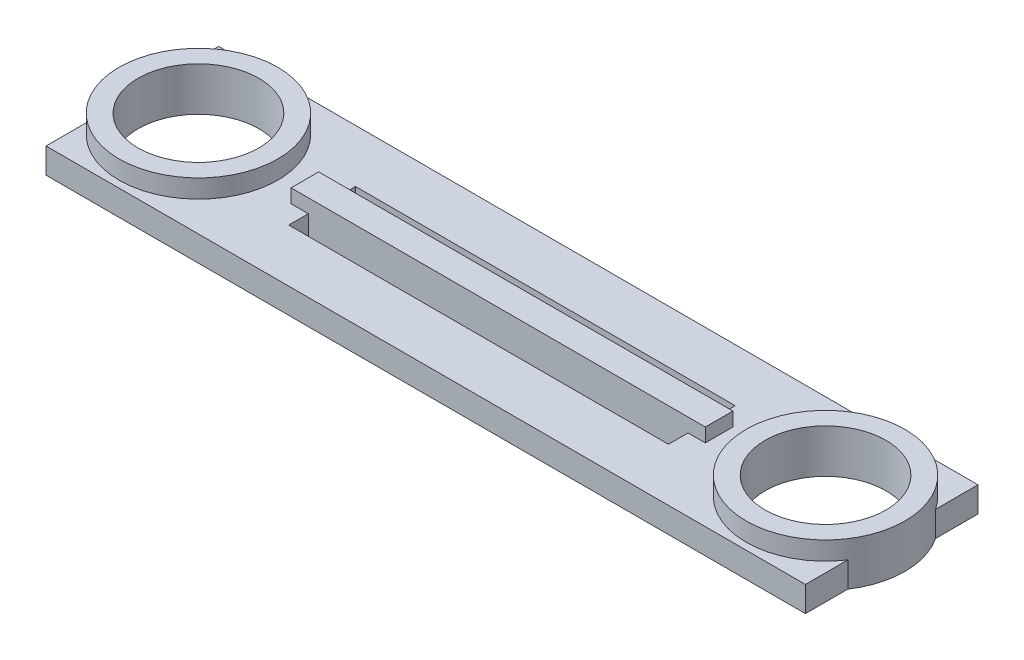
ISO-10303-21;
HEADER;
FILE_DESCRIPTION(('STEP AP214'),'2;1');
FILE_NAME('part.step','',(''),(''),'','','');
FILE_SCHEMA(('AUTOMOTIVE_DESIGN { 1 0 10303 214 1 1 1 1 }'));
ENDSEC;
DATA;
#1=APPLICATION_CONTEXT('core data for automotive mechanical design processes');
#2=APPLICATION_PROTOCOL_DEFINITION('international standard','automotive_design',2000,#1);
#3=PRODUCT_CONTEXT('',#1,'mechanical');
#4=PRODUCT('Part','Part','',(#3));
#5=PRODUCT_RELATED_PRODUCT_CATEGORY('part','',(#4));
#6=PRODUCT_DEFINITION_FORMATION('','',#4);
#7=PRODUCT_DEFINITION_CONTEXT('part definition',#1,'design');
#8=PRODUCT_DEFINITION('design','',#6,#7);
#9=PRODUCT_DEFINITION_SHAPE('','',#8);
#10=(LENGTH_UNIT() NAMED_UNIT(*) SI_UNIT(.MILLI.,.METRE.));
#11=(NAMED_UNIT(*) PLANE_ANGLE_UNIT() SI_UNIT($,.RADIAN.));
#12=(NAMED_UNIT(*) SI_UNIT($,.STERADIAN.) SOLID_ANGLE_UNIT());
#13=UNCERTAINTY_MEASURE_WITH_UNIT(LENGTH_MEASURE(1.E-05),#10,'distance_accuracy_value','');
#14=(GEOMETRIC_REPRESENTATION_CONTEXT(3) GLOBAL_UNCERTAINTY_ASSIGNED_CONTEXT((#13)) GLOBAL_UNIT_ASSIGNED_CONTEXT((#10,
#11,#12)) REPRESENTATION_CONTEXT('',''));
#15=CARTESIAN_POINT('',(0.,0.,0.));
#16=DIRECTION('',(0.,0.,1.));
#17=DIRECTION('',(1.,0.,0.));
#18=AXIS2_PLACEMENT_3D('',#15,#16,#17);
#19=CARTESIAN_POINT('',(0.,22.,0.));
#20=DIRECTION('',(0.,-1.,0.));
#21=DIRECTION('',(0.,0.,-1.));
#22=AXIS2_PLACEMENT_3D('',#19,#20,#21);
#23=PLANE('',#22);
#24=CARTESIAN_POINT('',(272.5,22.,0.));
#25=DIRECTION('',(0.,-1.,0.));
#26=DIRECTION('',(0.,0.,-1.));
#27=AXIS2_PLACEMENT_3D('',#24,#25,#26);
#28=CIRCLE('',#27,69.);
#29=CARTESIAN_POINT('',(330.,22.,-38.1411850890871));
#30=VERTEX_POINT('',#29);
#31=CARTESIAN_POINT('',(330.,22.,38.1411850890871));
#32=VERTEX_POINT('',#31);
#33=EDGE_CURVE('E229',#30,#32,#28,.F.);
#34=ORIENTED_EDGE('',*,*,#33,.F.);
#35=DIRECTION('',(0.,0.,-1.));
#36=VECTOR('',#35,1.);
#37=CARTESIAN_POINT('',(330.,22.,75.));
#38=LINE('',#37,#36);
#39=CARTESIAN_POINT('',(330.,22.,-75.));
#40=VERTEX_POINT('',#39);
#41=EDGE_CURVE('E290',#30,#40,#38,.T.);
#42=ORIENTED_EDGE('',*,*,#41,.T.);
#43=DIRECTION('',(-1.,0.,0.));
#44=VECTOR('',#43,1.);
#45=CARTESIAN_POINT('',(-330.,22.,-75.));
#46=LINE('',#45,#44);
#47=CARTESIAN_POINT('',(-330.,22.,-75.));
#48=VERTEX_POINT('',#47);
#49=EDGE_CURVE('E289',#40,#48,#46,.T.);
#50=ORIENTED_EDGE('',*,*,#49,.T.);
#51=DIRECTION('',(0.,0.,1.));
#52=VECTOR('',#51,1.);
#53=CARTESIAN_POINT('',(-330.,22.,75.));
#54=LINE('',#53,#52);
#55=CARTESIAN_POINT('',(-330.,22.,-38.1411850890871));
#56=VERTEX_POINT('',#55);
#57=EDGE_CURVE('E293',#48,#56,#54,.T.);
#58=ORIENTED_EDGE('',*,*,#57,.T.);
#59=CARTESIAN_POINT('',(-272.5,22.,0.));
#60=DIRECTION('',(0.,-1.,0.));
#61=DIRECTION('',(0.,0.,-1.));
#62=AXIS2_PLACEMENT_3D('',#59,#60,#61);
#63=CIRCLE('',#62,69.);
#64=CARTESIAN_POINT('',(-330.,22.,38.1411850890871));
#65=VERTEX_POINT('',#64);
#66=EDGE_CURVE('E239',#65,#56,#63,.F.);
#67=ORIENTED_EDGE('',*,*,#66,.F.);
#68=CARTESIAN_POINT('',(-330.,22.,75.));
#69=VERTEX_POINT('',#68);
#70=EDGE_CURVE('E292',#65,#69,#54,.T.);
#71=ORIENTED_EDGE('',*,*,#70,.T.);
#72=DIRECTION('',(1.,0.,0.));
#73=VECTOR('',#72,1.);
#74=CARTESIAN_POINT('',(-330.,22.,75.));
#75=LINE('',#74,#73);
#76=CARTESIAN_POINT('',(330.,22.,75.));
#77=VERTEX_POINT('',#76);
#78=EDGE_CURVE('E296',#69,#77,#75,.T.);
#79=ORIENTED_EDGE('',*,*,#78,.T.);
#80=EDGE_CURVE('E286',#77,#32,#38,.T.);
#81=ORIENTED_EDGE('',*,*,#80,.T.);
#82=EDGE_LOOP('',(#34,#42,#50,#58,#67,#71,#79,#81));
#83=FACE_BOUND('',#82,.T.);
#84=DIRECTION('',(-1.,0.,0.));
#85=VECTOR('',#84,1.);
#86=CARTESIAN_POINT('',(0.,22.,-12.));
#87=LINE('',#86,#85);
#88=CARTESIAN_POINT('',(-165.,22.,-12.));
#89=VERTEX_POINT('',#88);
#90=CARTESIAN_POINT('',(-180.,22.,-12.));
#91=VERTEX_POINT('',#90);
#92=EDGE_CURVE('E211',#89,#91,#87,.T.);
#93=ORIENTED_EDGE('',*,*,#92,.F.);
#94=DIRECTION('',(0.,0.,1.));
#95=VECTOR('',#94,1.);
#96=CARTESIAN_POINT('',(-165.,22.,29.));
#97=LINE('',#96,#95);
#98=CARTESIAN_POINT('',(-165.,22.,-29.));
#99=VERTEX_POINT('',#98);
#100=EDGE_CURVE('E252',#99,#89,#97,.T.);
#101=ORIENTED_EDGE('',*,*,#100,.F.);
#102=DIRECTION('',(-1.,0.,0.));
#103=VECTOR('',#102,1.);
#104=CARTESIAN_POINT('',(-165.,22.,-29.));
#105=LINE('',#104,#103);
#106=CARTESIAN_POINT('',(165.,22.,-29.));
#107=VERTEX_POINT('',#106);
#108=EDGE_CURVE('E248',#107,#99,#105,.T.);
#109=ORIENTED_EDGE('',*,*,#108,.F.);
#110=DIRECTION('',(0.,0.,-1.));
#111=VECTOR('',#110,1.);
#112=CARTESIAN_POINT('',(165.,22.,29.));
#113=LINE('',#112,#111);
#114=CARTESIAN_POINT('',(165.,22.,-12.));
#115=VERTEX_POINT('',#114);
#116=EDGE_CURVE('E249',#115,#107,#113,.T.);
#117=ORIENTED_EDGE('',*,*,#116,.F.);
#118=CARTESIAN_POINT('',(180.,22.,-12.));
#119=VERTEX_POINT('',#118);
#120=EDGE_CURVE('E214',#119,#115,#87,.T.);
#121=ORIENTED_EDGE('',*,*,#120,.F.);
#122=DIRECTION('',(0.,0.,-1.));
#123=VECTOR('',#122,1.);
#124=CARTESIAN_POINT('',(180.,22.,0.));
#125=LINE('',#124,#123);
#126=CARTESIAN_POINT('',(180.,22.,12.));
#127=VERTEX_POINT('',#126);
#128=EDGE_CURVE('E199',#127,#119,#125,.T.);
#129=ORIENTED_EDGE('',*,*,#128,.F.);
#130=DIRECTION('',(1.,0.,0.));
#131=VECTOR('',#130,1.);
#132=CARTESIAN_POINT('',(0.,22.,12.));
#133=LINE('',#132,#131);
#134=CARTESIAN_POINT('',(165.,22.,12.));
#135=VERTEX_POINT('',#134);
#136=EDGE_CURVE('E204',#135,#127,#133,.T.);
#137=ORIENTED_EDGE('',*,*,#136,.F.);
#138=CARTESIAN_POINT('',(165.,22.,29.));
#139=VERTEX_POINT('',#138);
#140=EDGE_CURVE('E245',#139,#135,#113,.T.);
#141=ORIENTED_EDGE('',*,*,#140,.F.);
#142=DIRECTION('',(1.,0.,0.));
#143=VECTOR('',#142,1.);
#144=CARTESIAN_POINT('',(-165.,22.,29.));
#145=LINE('',#144,#143);
#146=CARTESIAN_POINT('',(-165.,22.,29.));
#147=VERTEX_POINT('',#146);
#148=EDGE_CURVE('E255',#147,#139,#145,.T.);
#149=ORIENTED_EDGE('',*,*,#148,.F.);
#150=CARTESIAN_POINT('',(-165.,22.,12.));
#151=VERTEX_POINT('',#150);
#152=EDGE_CURVE('E251',#151,#147,#97,.T.);
#153=ORIENTED_EDGE('',*,*,#152,.F.);
#154=CARTESIAN_POINT('',(-180.,22.,12.));
#155=VERTEX_POINT('',#154);
#156=EDGE_CURVE('E200',#155,#151,#133,.T.);
#157=ORIENTED_EDGE('',*,*,#156,.F.);
#158=DIRECTION('',(0.,0.,1.));
#159=VECTOR('',#158,1.);
#160=CARTESIAN_POINT('',(-180.,22.,0.));
#161=LINE('',#160,#159);
#162=EDGE_CURVE('E217',#91,#155,#161,.T.);
#163=ORIENTED_EDGE('',*,*,#162,.F.);
#164=EDGE_LOOP('',(#93,#101,#109,#117,#121,#129,#137,#141,#149,#153,#157,#163));
#165=FACE_BOUND('',#164,.T.);
#166=ADVANCED_FACE('F39',(#83,#165),#23,.F.);
#167=CARTESIAN_POINT('',(165.,22.,29.));
#168=DIRECTION('',(-1.,0.,0.));
#169=DIRECTION('',(0.,0.,1.));
#170=AXIS2_PLACEMENT_3D('',#167,#168,#169);
#171=PLANE('',#170);
#172=DIRECTION('',(0.,0.,-1.));
#173=VECTOR('',#172,1.);
#174=CARTESIAN_POINT('',(165.,0.,29.));
#175=LINE('',#174,#173);
#176=CARTESIAN_POINT('',(165.,0.,-12.));
#177=VERTEX_POINT('',#176);
#178=CARTESIAN_POINT('',(165.,0.,-29.));
#179=VERTEX_POINT('',#178);
#180=EDGE_CURVE('E244',#177,#179,#175,.T.);
#181=ORIENTED_EDGE('',*,*,#180,.F.);
#182=DIRECTION('',(0.,1.,0.));
#183=VECTOR('',#182,1.);
#184=CARTESIAN_POINT('',(165.,22.,-12.));
#185=LINE('',#184,#183);
#186=EDGE_CURVE('E213',#177,#115,#185,.T.);
#187=ORIENTED_EDGE('',*,*,#186,.T.);
#188=ORIENTED_EDGE('',*,*,#116,.T.);
#189=DIRECTION('',(0.,-1.,0.));
#190=VECTOR('',#189,1.);
#191=CARTESIAN_POINT('',(165.,22.,-29.));
#192=LINE('',#191,#190);
#193=EDGE_CURVE('E276',#107,#179,#192,.T.);
#194=ORIENTED_EDGE('',*,*,#193,.T.);
#195=EDGE_LOOP('',(#181,#187,#188,#194));
#196=FACE_BOUND('',#195,.T.);
#197=ADVANCED_FACE('F389',(#196),#171,.T.);
#198=ORIENTED_EDGE('',*,*,#140,.T.);
#199=DIRECTION('',(0.,-1.,0.));
#200=VECTOR('',#199,1.);
#201=CARTESIAN_POINT('',(165.,22.,12.));
#202=LINE('',#201,#200);
#203=CARTESIAN_POINT('',(165.,0.,12.));
#204=VERTEX_POINT('',#203);
#205=EDGE_CURVE('E202',#135,#204,#202,.T.);
#206=ORIENTED_EDGE('',*,*,#205,.T.);
#207=CARTESIAN_POINT('',(165.,0.,29.));
#208=VERTEX_POINT('',#207);
#209=EDGE_CURVE('E258',#208,#204,#175,.T.);
#210=ORIENTED_EDGE('',*,*,#209,.F.);
#211=DIRECTION('',(0.,-1.,0.));
#212=VECTOR('',#211,1.);
#213=CARTESIAN_POINT('',(165.,22.,29.));
#214=LINE('',#213,#212);
#215=EDGE_CURVE('E257',#139,#208,#214,.T.);
#216=ORIENTED_EDGE('',*,*,#215,.F.);
#217=EDGE_LOOP('',(#198,#206,#210,#216));
#218=FACE_BOUND('',#217,.T.);
#219=ADVANCED_FACE('F349',(#218),#171,.T.);
#220=CARTESIAN_POINT('',(-165.,22.,29.));
#221=DIRECTION('',(1.,0.,0.));
#222=DIRECTION('',(0.,0.,-1.));
#223=AXIS2_PLACEMENT_3D('',#220,#221,#222);
#224=PLANE('',#223);
#225=ORIENTED_EDGE('',*,*,#100,.T.);
#226=DIRECTION('',(0.,-1.,0.));
#227=VECTOR('',#226,1.);
#228=CARTESIAN_POINT('',(-165.,22.,-12.));
#229=LINE('',#228,#227);
#230=CARTESIAN_POINT('',(-165.,0.,-12.));
#231=VERTEX_POINT('',#230);
#232=EDGE_CURVE('E11',#89,#231,#229,.T.);
#233=ORIENTED_EDGE('',*,*,#232,.T.);
#234=DIRECTION('',(0.,0.,1.));
#235=VECTOR('',#234,1.);
#236=CARTESIAN_POINT('',(-165.,0.,29.));
#237=LINE('',#236,#235);
#238=CARTESIAN_POINT('',(-165.,0.,-29.));
#239=VERTEX_POINT('',#238);
#240=EDGE_CURVE('E264',#239,#231,#237,.T.);
#241=ORIENTED_EDGE('',*,*,#240,.F.);
#242=DIRECTION('',(0.,-1.,0.));
#243=VECTOR('',#242,1.);
#244=CARTESIAN_POINT('',(-165.,22.,-29.));
#245=LINE('',#244,#243);
#246=EDGE_CURVE('E274',#99,#239,#245,.T.);
#247=ORIENTED_EDGE('',*,*,#246,.F.);
#248=EDGE_LOOP('',(#225,#233,#241,#247));
#249=FACE_BOUND('',#248,.T.);
#250=ADVANCED_FACE('F437',(#249),#224,.T.);
#251=CARTESIAN_POINT('',(-165.,0.,12.));
#252=VERTEX_POINT('',#251);
#253=CARTESIAN_POINT('',(-165.,0.,29.));
#254=VERTEX_POINT('',#253);
#255=EDGE_CURVE('E263',#252,#254,#237,.T.);
#256=ORIENTED_EDGE('',*,*,#255,.F.);
#257=DIRECTION('',(0.,1.,0.));
#258=VECTOR('',#257,1.);
#259=CARTESIAN_POINT('',(-165.,22.,12.));
#260=LINE('',#259,#258);
#261=EDGE_CURVE('E47',#252,#151,#260,.T.);
#262=ORIENTED_EDGE('',*,*,#261,.T.);
#263=ORIENTED_EDGE('',*,*,#152,.T.);
#264=DIRECTION('',(0.,-1.,0.));
#265=VECTOR('',#264,1.);
#266=CARTESIAN_POINT('',(-165.,22.,29.));
#267=LINE('',#266,#265);
#268=EDGE_CURVE('E271',#147,#254,#267,.T.);
#269=ORIENTED_EDGE('',*,*,#268,.T.);
#270=EDGE_LOOP('',(#256,#262,#263,#269));
#271=FACE_BOUND('',#270,.T.);
#272=ADVANCED_FACE('F334',(#271),#224,.T.);
#273=CARTESIAN_POINT('',(330.,22.,75.));
#274=DIRECTION('',(-1.,0.,0.));
#275=DIRECTION('',(0.,0.,1.));
#276=AXIS2_PLACEMENT_3D('',#273,#274,#275);
#277=PLANE('',#276);
#278=DIRECTION('',(0.,-1.,0.));
#279=VECTOR('',#278,1.);
#280=CARTESIAN_POINT('',(330.,38.,-38.1411850890871));
#281=LINE('',#280,#279);
#282=CARTESIAN_POINT('',(330.,0.,-38.1411850890871));
#283=VERTEX_POINT('',#282);
#284=EDGE_CURVE('E328',#283,#30,#281,.F.);
#285=ORIENTED_EDGE('',*,*,#284,.F.);
#286=DIRECTION('',(0.,0.,-1.));
#287=VECTOR('',#286,1.);
#288=CARTESIAN_POINT('',(330.,0.,75.));
#289=LINE('',#288,#287);
#290=CARTESIAN_POINT('',(330.,0.,-75.));
#291=VERTEX_POINT('',#290);
#292=EDGE_CURVE('E285',#283,#291,#289,.T.);
#293=ORIENTED_EDGE('',*,*,#292,.T.);
#294=DIRECTION('',(0.,-1.,0.));
#295=VECTOR('',#294,1.);
#296=CARTESIAN_POINT('',(330.,22.,-75.));
#297=LINE('',#296,#295);
#298=EDGE_CURVE('E316',#40,#291,#297,.T.);
#299=ORIENTED_EDGE('',*,*,#298,.F.);
#300=ORIENTED_EDGE('',*,*,#41,.F.);
#301=EDGE_LOOP('',(#285,#293,#299,#300));
#302=FACE_BOUND('',#301,.T.);
#303=ADVANCED_FACE('F41',(#302),#277,.F.);
#304=DIRECTION('',(0.,-1.,0.));
#305=VECTOR('',#304,1.);
#306=CARTESIAN_POINT('',(330.,38.,38.1411850890871));
#307=LINE('',#306,#305);
#308=CARTESIAN_POINT('',(330.,0.,38.1411850890871));
#309=VERTEX_POINT('',#308);
#310=EDGE_CURVE('E325',#32,#309,#307,.T.);
#311=ORIENTED_EDGE('',*,*,#310,.F.);
#312=ORIENTED_EDGE('',*,*,#80,.F.);
#313=DIRECTION('',(0.,-1.,0.));
#314=VECTOR('',#313,1.);
#315=CARTESIAN_POINT('',(330.,22.,75.));
#316=LINE('',#315,#314);
#317=CARTESIAN_POINT('',(330.,0.,75.));
#318=VERTEX_POINT('',#317);
#319=EDGE_CURVE('E298',#77,#318,#316,.T.);
#320=ORIENTED_EDGE('',*,*,#319,.T.);
#321=EDGE_CURVE('E299',#318,#309,#289,.T.);
#322=ORIENTED_EDGE('',*,*,#321,.T.);
#323=EDGE_LOOP('',(#311,#312,#320,#322));
#324=FACE_BOUND('',#323,.T.);
#325=ADVANCED_FACE('F404',(#324),#277,.F.);
#326=CARTESIAN_POINT('',(-330.,22.,75.));
#327=DIRECTION('',(1.,0.,0.));
#328=DIRECTION('',(0.,0.,-1.));
#329=AXIS2_PLACEMENT_3D('',#326,#327,#328);
#330=PLANE('',#329);
#331=DIRECTION('',(0.,-1.,0.));
#332=VECTOR('',#331,1.);
#333=CARTESIAN_POINT('',(-330.,38.,38.1411850890871));
#334=LINE('',#333,#332);
#335=CARTESIAN_POINT('',(-330.,0.,38.1411850890871));
#336=VERTEX_POINT('',#335);
#337=EDGE_CURVE('E322',#336,#65,#334,.F.);
#338=ORIENTED_EDGE('',*,*,#337,.F.);
#339=DIRECTION('',(0.,0.,1.));
#340=VECTOR('',#339,1.);
#341=CARTESIAN_POINT('',(-330.,0.,75.));
#342=LINE('',#341,#340);
#343=CARTESIAN_POINT('',(-330.,0.,75.));
#344=VERTEX_POINT('',#343);
#345=EDGE_CURVE('E303',#336,#344,#342,.T.);
#346=ORIENTED_EDGE('',*,*,#345,.T.);
#347=DIRECTION('',(0.,-1.,0.));
#348=VECTOR('',#347,1.);
#349=CARTESIAN_POINT('',(-330.,22.,75.));
#350=LINE('',#349,#348);
#351=EDGE_CURVE('E310',#69,#344,#350,.T.);
#352=ORIENTED_EDGE('',*,*,#351,.F.);
#353=ORIENTED_EDGE('',*,*,#70,.F.);
#354=EDGE_LOOP('',(#338,#346,#352,#353));
#355=FACE_BOUND('',#354,.T.);
#356=ADVANCED_FACE('F402',(#355),#330,.F.);
#357=DIRECTION('',(0.,-1.,0.));
#358=VECTOR('',#357,1.);
#359=CARTESIAN_POINT('',(-330.,38.,-38.1411850890871));
#360=LINE('',#359,#358);
#361=CARTESIAN_POINT('',(-330.,0.,-38.1411850890871));
#362=VERTEX_POINT('',#361);
#363=EDGE_CURVE('E319',#56,#362,#360,.T.);
#364=ORIENTED_EDGE('',*,*,#363,.F.);
#365=ORIENTED_EDGE('',*,*,#57,.F.);
#366=DIRECTION('',(0.,-1.,0.));
#367=VECTOR('',#366,1.);
#368=CARTESIAN_POINT('',(-330.,22.,-75.));
#369=LINE('',#368,#367);
#370=CARTESIAN_POINT('',(-330.,0.,-75.));
#371=VERTEX_POINT('',#370);
#372=EDGE_CURVE('E313',#48,#371,#369,.T.);
#373=ORIENTED_EDGE('',*,*,#372,.T.);
#374=EDGE_CURVE('E304',#371,#362,#342,.T.);
#375=ORIENTED_EDGE('',*,*,#374,.T.);
#376=EDGE_LOOP('',(#364,#365,#373,#375));
#377=FACE_BOUND('',#376,.T.);
#378=ADVANCED_FACE('F354',(#377),#330,.F.);
#379=CARTESIAN_POINT('',(0.,0.,0.));
#380=DIRECTION('',(0.,-1.,0.));
#381=DIRECTION('',(0.,0.,-1.));
#382=AXIS2_PLACEMENT_3D('',#379,#380,#381);
#383=PLANE('',#382);
#384=DIRECTION('',(-1.,0.,0.));
#385=VECTOR('',#384,1.);
#386=CARTESIAN_POINT('',(-180.,0.,-12.));
#387=LINE('',#386,#385);
#388=EDGE_CURVE('E54',#177,#231,#387,.T.);
#389=ORIENTED_EDGE('',*,*,#388,.F.);
#390=ORIENTED_EDGE('',*,*,#180,.T.);
#391=DIRECTION('',(-1.,0.,0.));
#392=VECTOR('',#391,1.);
#393=CARTESIAN_POINT('',(-165.,0.,-29.));
#394=LINE('',#393,#392);
#395=EDGE_CURVE('E260',#179,#239,#394,.T.);
#396=ORIENTED_EDGE('',*,*,#395,.T.);
#397=ORIENTED_EDGE('',*,*,#240,.T.);
#398=EDGE_LOOP('',(#389,#390,#396,#397));
#399=FACE_BOUND('',#398,.T.);
#400=DIRECTION('',(1.,0.,0.));
#401=VECTOR('',#400,1.);
#402=CARTESIAN_POINT('',(-180.,0.,12.));
#403=LINE('',#402,#401);
#404=EDGE_CURVE('E62',#252,#204,#403,.T.);
#405=ORIENTED_EDGE('',*,*,#404,.F.);
#406=ORIENTED_EDGE('',*,*,#255,.T.);
#407=DIRECTION('',(1.,0.,0.));
#408=VECTOR('',#407,1.);
#409=CARTESIAN_POINT('',(-165.,0.,29.));
#410=LINE('',#409,#408);
#411=EDGE_CURVE('E266',#254,#208,#410,.T.);
#412=ORIENTED_EDGE('',*,*,#411,.T.);
#413=ORIENTED_EDGE('',*,*,#209,.T.);
#414=EDGE_LOOP('',(#405,#406,#412,#413));
#415=FACE_BOUND('',#414,.T.);
#416=CARTESIAN_POINT('',(272.5,0.,0.));
#417=DIRECTION('',(0.,1.,0.));
#418=DIRECTION('',(0.,0.,1.));
#419=AXIS2_PLACEMENT_3D('',#416,#417,#418);
#420=CIRCLE('',#419,69.);
#421=EDGE_CURVE('E221',#309,#283,#420,.T.);
#422=ORIENTED_EDGE('',*,*,#421,.F.);
#423=ORIENTED_EDGE('',*,*,#321,.F.);
#424=DIRECTION('',(1.,0.,0.));
#425=VECTOR('',#424,1.);
#426=CARTESIAN_POINT('',(-330.,0.,75.));
#427=LINE('',#426,#425);
#428=EDGE_CURVE('E306',#344,#318,#427,.T.);
#429=ORIENTED_EDGE('',*,*,#428,.F.);
#430=ORIENTED_EDGE('',*,*,#345,.F.);
#431=CARTESIAN_POINT('',(-272.5,0.,0.));
#432=DIRECTION('',(0.,1.,0.));
#433=DIRECTION('',(0.,0.,1.));
#434=AXIS2_PLACEMENT_3D('',#431,#432,#433);
#435=CIRCLE('',#434,69.);
#436=EDGE_CURVE('E235',#362,#336,#435,.T.);
#437=ORIENTED_EDGE('',*,*,#436,.F.);
#438=ORIENTED_EDGE('',*,*,#374,.F.);
#439=DIRECTION('',(-1.,0.,0.));
#440=VECTOR('',#439,1.);
#441=CARTESIAN_POINT('',(-330.,0.,-75.));
#442=LINE('',#441,#440);
#443=EDGE_CURVE('E301',#291,#371,#442,.T.);
#444=ORIENTED_EDGE('',*,*,#443,.F.);
#445=ORIENTED_EDGE('',*,*,#292,.F.);
#446=EDGE_LOOP('',(#422,#423,#429,#430,#437,#438,#444,#445));
#447=FACE_BOUND('',#446,.T.);
#448=CARTESIAN_POINT('',(272.5,0.,0.));
#449=DIRECTION('',(0.,1.,0.));
#450=DIRECTION('',(0.,0.,1.));
#451=AXIS2_PLACEMENT_3D('',#448,#449,#450);
#452=CIRCLE('',#451,52.5);
#453=CARTESIAN_POINT('',(272.5,0.,52.5));
#454=VERTEX_POINT('',#453);
#455=EDGE_CURVE('E279',#454,#454,#452,.T.);
#456=ORIENTED_EDGE('',*,*,#455,.T.);
#457=EDGE_LOOP('',(#456));
#458=FACE_BOUND('',#457,.T.);
#459=CARTESIAN_POINT('',(-272.5,0.,0.));
#460=DIRECTION('',(0.,1.,0.));
#461=DIRECTION('',(0.,0.,1.));
#462=AXIS2_PLACEMENT_3D('',#459,#460,#461);
#463=CIRCLE('',#462,52.5);
#464=CARTESIAN_POINT('',(-272.5,0.,52.5));
#465=VERTEX_POINT('',#464);
#466=EDGE_CURVE('E282',#465,#465,#463,.T.);
#467=ORIENTED_EDGE('',*,*,#466,.T.);
#468=EDGE_LOOP('',(#467));
#469=FACE_BOUND('',#468,.T.);
#470=ADVANCED_FACE('F350',(#399,#415,#447,#458,#469),#383,.T.);
#471=CARTESIAN_POINT('',(-330.,22.,-75.));
#472=DIRECTION('',(0.,0.,1.));
#473=DIRECTION('',(1.,0.,0.));
#474=AXIS2_PLACEMENT_3D('',#471,#472,#473);
#475=PLANE('',#474);
#476=ORIENTED_EDGE('',*,*,#443,.T.);
#477=ORIENTED_EDGE('',*,*,#372,.F.);
#478=ORIENTED_EDGE('',*,*,#49,.F.);
#479=ORIENTED_EDGE('',*,*,#298,.T.);
#480=EDGE_LOOP('',(#476,#477,#478,#479));
#481=FACE_BOUND('',#480,.T.);
#482=ADVANCED_FACE('F353',(#481),#475,.F.);
#483=CARTESIAN_POINT('',(-330.,22.,75.));
#484=DIRECTION('',(0.,0.,-1.));
#485=DIRECTION('',(-1.,0.,0.));
#486=AXIS2_PLACEMENT_3D('',#483,#484,#485);
#487=PLANE('',#486);
#488=ORIENTED_EDGE('',*,*,#428,.T.);
#489=ORIENTED_EDGE('',*,*,#319,.F.);
#490=ORIENTED_EDGE('',*,*,#78,.F.);
#491=ORIENTED_EDGE('',*,*,#351,.T.);
#492=EDGE_LOOP('',(#488,#489,#490,#491));
#493=FACE_BOUND('',#492,.T.);
#494=ADVANCED_FACE('F368',(#493),#487,.F.);
#495=CARTESIAN_POINT('',(-272.5,22.,0.));
#496=DIRECTION('',(0.,-1.,0.));
#497=DIRECTION('',(0.,0.,-1.));
#498=AXIS2_PLACEMENT_3D('',#495,#496,#497);
#499=CYLINDRICAL_SURFACE('',#498,52.5);
#500=ORIENTED_EDGE('',*,*,#466,.F.);
#501=EDGE_LOOP('',(#500));
#502=FACE_BOUND('',#501,.T.);
#503=CARTESIAN_POINT('',(-272.5,38.,0.));
#504=DIRECTION('',(0.,1.,0.));
#505=DIRECTION('',(0.,0.,1.));
#506=AXIS2_PLACEMENT_3D('',#503,#504,#505);
#507=CIRCLE('',#506,52.5);
#508=CARTESIAN_POINT('',(-272.5,38.,52.5));
#509=VERTEX_POINT('',#508);
#510=EDGE_CURVE('E232',#509,#509,#507,.T.);
#511=ORIENTED_EDGE('',*,*,#510,.T.);
#512=EDGE_LOOP('',(#511));
#513=FACE_BOUND('',#512,.T.);
#514=ADVANCED_FACE('F364',(#502,#513),#499,.F.);
#515=CARTESIAN_POINT('',(272.5,22.,0.));
#516=DIRECTION('',(0.,-1.,0.));
#517=DIRECTION('',(0.,0.,-1.));
#518=AXIS2_PLACEMENT_3D('',#515,#516,#517);
#519=CYLINDRICAL_SURFACE('',#518,52.5);
#520=ORIENTED_EDGE('',*,*,#455,.F.);
#521=EDGE_LOOP('',(#520));
#522=FACE_BOUND('',#521,.T.);
#523=CARTESIAN_POINT('',(272.5,38.,0.));
#524=DIRECTION('',(0.,1.,0.));
#525=DIRECTION('',(0.,0.,1.));
#526=AXIS2_PLACEMENT_3D('',#523,#524,#525);
#527=CIRCLE('',#526,52.5);
#528=CARTESIAN_POINT('',(272.5,38.,52.5));
#529=VERTEX_POINT('',#528);
#530=EDGE_CURVE('E224',#529,#529,#527,.T.);
#531=ORIENTED_EDGE('',*,*,#530,.T.);
#532=EDGE_LOOP('',(#531));
#533=FACE_BOUND('',#532,.T.);
#534=ADVANCED_FACE('F367',(#522,#533),#519,.F.);
#535=CARTESIAN_POINT('',(-165.,22.,-29.));
#536=DIRECTION('',(0.,0.,1.));
#537=DIRECTION('',(1.,0.,0.));
#538=AXIS2_PLACEMENT_3D('',#535,#536,#537);
#539=PLANE('',#538);
#540=ORIENTED_EDGE('',*,*,#395,.F.);
#541=ORIENTED_EDGE('',*,*,#193,.F.);
#542=ORIENTED_EDGE('',*,*,#108,.T.);
#543=ORIENTED_EDGE('',*,*,#246,.T.);
#544=EDGE_LOOP('',(#540,#541,#542,#543));
#545=FACE_BOUND('',#544,.T.);
#546=ADVANCED_FACE('F445',(#545),#539,.T.);
#547=CARTESIAN_POINT('',(-165.,22.,29.));
#548=DIRECTION('',(0.,0.,-1.));
#549=DIRECTION('',(-1.,0.,0.));
#550=AXIS2_PLACEMENT_3D('',#547,#548,#549);
#551=PLANE('',#550);
#552=ORIENTED_EDGE('',*,*,#411,.F.);
#553=ORIENTED_EDGE('',*,*,#268,.F.);
#554=ORIENTED_EDGE('',*,*,#148,.T.);
#555=ORIENTED_EDGE('',*,*,#215,.T.);
#556=EDGE_LOOP('',(#552,#553,#554,#555));
#557=FACE_BOUND('',#556,.T.);
#558=ADVANCED_FACE('F347',(#557),#551,.T.);
#559=CARTESIAN_POINT('',(-272.5,38.,0.));
#560=DIRECTION('',(0.,-1.,0.));
#561=DIRECTION('',(0.,0.,-1.));
#562=AXIS2_PLACEMENT_3D('',#559,#560,#561);
#563=CYLINDRICAL_SURFACE('',#562,69.);
#564=CARTESIAN_POINT('',(-272.5,38.,0.));
#565=DIRECTION('',(0.,1.,0.));
#566=DIRECTION('',(0.,0.,1.));
#567=AXIS2_PLACEMENT_3D('',#564,#565,#566);
#568=CIRCLE('',#567,69.);
#569=CARTESIAN_POINT('',(-272.5,38.,69.));
#570=VERTEX_POINT('',#569);
#571=EDGE_CURVE('E236',#570,#570,#568,.T.);
#572=ORIENTED_EDGE('',*,*,#571,.F.);
#573=EDGE_LOOP('',(#572));
#574=FACE_BOUND('',#573,.T.);
#575=ORIENTED_EDGE('',*,*,#436,.T.);
#576=ORIENTED_EDGE('',*,*,#337,.T.);
#577=ORIENTED_EDGE('',*,*,#66,.T.);
#578=ORIENTED_EDGE('',*,*,#363,.T.);
#579=EDGE_LOOP('',(#575,#576,#577,#578));
#580=FACE_BOUND('',#579,.T.);
#581=ADVANCED_FACE('F375',(#574,#580),#563,.T.);
#582=CARTESIAN_POINT('',(-272.5,38.,0.));
#583=DIRECTION('',(0.,1.,0.));
#584=DIRECTION('',(0.,0.,1.));
#585=AXIS2_PLACEMENT_3D('',#582,#583,#584);
#586=PLANE('',#585);
#587=ORIENTED_EDGE('',*,*,#571,.T.);
#588=EDGE_LOOP('',(#587));
#589=FACE_BOUND('',#588,.T.);
#590=ORIENTED_EDGE('',*,*,#510,.F.);
#591=EDGE_LOOP('',(#590));
#592=FACE_BOUND('',#591,.T.);
#593=ADVANCED_FACE('F372',(#589,#592),#586,.T.);
#594=CARTESIAN_POINT('',(272.5,38.,0.));
#595=DIRECTION('',(0.,-1.,0.));
#596=DIRECTION('',(0.,0.,-1.));
#597=AXIS2_PLACEMENT_3D('',#594,#595,#596);
#598=CYLINDRICAL_SURFACE('',#597,69.);
#599=CARTESIAN_POINT('',(272.5,38.,0.));
#600=DIRECTION('',(0.,1.,0.));
#601=DIRECTION('',(0.,0.,1.));
#602=AXIS2_PLACEMENT_3D('',#599,#600,#601);
#603=CIRCLE('',#602,69.);
#604=CARTESIAN_POINT('',(272.5,38.,69.));
#605=VERTEX_POINT('',#604);
#606=EDGE_CURVE('E220',#605,#605,#603,.T.);
#607=ORIENTED_EDGE('',*,*,#606,.F.);
#608=EDGE_LOOP('',(#607));
#609=FACE_BOUND('',#608,.T.);
#610=ORIENTED_EDGE('',*,*,#421,.T.);
#611=ORIENTED_EDGE('',*,*,#284,.T.);
#612=ORIENTED_EDGE('',*,*,#33,.T.);
#613=ORIENTED_EDGE('',*,*,#310,.T.);
#614=EDGE_LOOP('',(#610,#611,#612,#613));
#615=FACE_BOUND('',#614,.T.);
#616=ADVANCED_FACE('F374',(#609,#615),#598,.T.);
#617=CARTESIAN_POINT('',(272.5,38.,0.));
#618=DIRECTION('',(0.,1.,0.));
#619=DIRECTION('',(0.,0.,1.));
#620=AXIS2_PLACEMENT_3D('',#617,#618,#619);
#621=PLANE('',#620);
#622=ORIENTED_EDGE('',*,*,#606,.T.);
#623=EDGE_LOOP('',(#622));
#624=FACE_BOUND('',#623,.T.);
#625=ORIENTED_EDGE('',*,*,#530,.F.);
#626=EDGE_LOOP('',(#625));
#627=FACE_BOUND('',#626,.T.);
#628=ADVANCED_FACE('F382',(#624,#627),#621,.T.);
#629=CARTESIAN_POINT('',(180.,34.,12.));
#630=DIRECTION('',(-1.,0.,0.));
#631=DIRECTION('',(0.,0.,1.));
#632=AXIS2_PLACEMENT_3D('',#629,#630,#631);
#633=PLANE('',#632);
#634=DIRECTION('',(0.,-1.,0.));
#635=VECTOR('',#634,1.);
#636=CARTESIAN_POINT('',(180.,34.,12.));
#637=LINE('',#636,#635);
#638=CARTESIAN_POINT('',(180.,34.,12.));
#639=VERTEX_POINT('',#638);
#640=EDGE_CURVE('E684',#639,#127,#637,.T.);
#641=ORIENTED_EDGE('',*,*,#640,.T.);
#642=ORIENTED_EDGE('',*,*,#128,.T.);
#643=DIRECTION('',(0.,-1.,0.));
#644=VECTOR('',#643,1.);
#645=CARTESIAN_POINT('',(180.,34.,-12.));
#646=LINE('',#645,#644);
#647=CARTESIAN_POINT('',(180.,34.,-12.));
#648=VERTEX_POINT('',#647);
#649=EDGE_CURVE('E180',#648,#119,#646,.T.);
#650=ORIENTED_EDGE('',*,*,#649,.F.);
#651=DIRECTION('',(0.,0.,-1.));
#652=VECTOR('',#651,1.);
#653=CARTESIAN_POINT('',(180.,34.,12.));
#654=LINE('',#653,#652);
#655=EDGE_CURVE('E187',#639,#648,#654,.T.);
#656=ORIENTED_EDGE('',*,*,#655,.F.);
#657=EDGE_LOOP('',(#641,#642,#650,#656));
#658=FACE_BOUND('',#657,.T.);
#659=ADVANCED_FACE('F197',(#658),#633,.F.);
#660=CARTESIAN_POINT('',(-180.,34.,12.));
#661=DIRECTION('',(1.,0.,0.));
#662=DIRECTION('',(0.,0.,-1.));
#663=AXIS2_PLACEMENT_3D('',#660,#661,#662);
#664=PLANE('',#663);
#665=DIRECTION('',(0.,-1.,0.));
#666=VECTOR('',#665,1.);
#667=CARTESIAN_POINT('',(-180.,34.,-12.));
#668=LINE('',#667,#666);
#669=CARTESIAN_POINT('',(-180.,34.,-12.));
#670=VERTEX_POINT('',#669);
#671=EDGE_CURVE('E183',#670,#91,#668,.T.);
#672=ORIENTED_EDGE('',*,*,#671,.T.);
#673=ORIENTED_EDGE('',*,*,#162,.T.);
#674=DIRECTION('',(0.,-1.,0.));
#675=VECTOR('',#674,1.);
#676=CARTESIAN_POINT('',(-180.,34.,12.));
#677=LINE('',#676,#675);
#678=CARTESIAN_POINT('',(-180.,34.,12.));
#679=VERTEX_POINT('',#678);
#680=EDGE_CURVE('E205',#679,#155,#677,.T.);
#681=ORIENTED_EDGE('',*,*,#680,.F.);
#682=DIRECTION('',(0.,0.,1.));
#683=VECTOR('',#682,1.);
#684=CARTESIAN_POINT('',(-180.,34.,12.));
#685=LINE('',#684,#683);
#686=EDGE_CURVE('E186',#670,#679,#685,.T.);
#687=ORIENTED_EDGE('',*,*,#686,.F.);
#688=EDGE_LOOP('',(#672,#673,#681,#687));
#689=FACE_BOUND('',#688,.T.);
#690=ADVANCED_FACE('F460',(#689),#664,.F.);
#691=CARTESIAN_POINT('',(-180.,34.,-12.));
#692=DIRECTION('',(0.,0.,1.));
#693=DIRECTION('',(1.,0.,0.));
#694=AXIS2_PLACEMENT_3D('',#691,#692,#693);
#695=PLANE('',#694);
#696=ORIENTED_EDGE('',*,*,#649,.T.);
#697=ORIENTED_EDGE('',*,*,#120,.T.);
#698=ORIENTED_EDGE('',*,*,#186,.F.);
#699=ORIENTED_EDGE('',*,*,#388,.T.);
#700=ORIENTED_EDGE('',*,*,#232,.F.);
#701=ORIENTED_EDGE('',*,*,#92,.T.);
#702=ORIENTED_EDGE('',*,*,#671,.F.);
#703=DIRECTION('',(-1.,0.,0.));
#704=VECTOR('',#703,1.);
#705=CARTESIAN_POINT('',(-180.,34.,-12.));
#706=LINE('',#705,#704);
#707=EDGE_CURVE('E176',#648,#670,#706,.T.);
#708=ORIENTED_EDGE('',*,*,#707,.F.);
#709=EDGE_LOOP('',(#696,#697,#698,#699,#700,#701,#702,#708));
#710=FACE_BOUND('',#709,.T.);
#711=ADVANCED_FACE('F178',(#710),#695,.F.);
#712=CARTESIAN_POINT('',(-180.,34.,12.));
#713=DIRECTION('',(0.,0.,-1.));
#714=DIRECTION('',(-1.,0.,0.));
#715=AXIS2_PLACEMENT_3D('',#712,#713,#714);
#716=PLANE('',#715);
#717=ORIENTED_EDGE('',*,*,#205,.F.);
#718=ORIENTED_EDGE('',*,*,#136,.T.);
#719=ORIENTED_EDGE('',*,*,#640,.F.);
#720=DIRECTION('',(1.,0.,0.));
#721=VECTOR('',#720,1.);
#722=CARTESIAN_POINT('',(-180.,34.,12.));
#723=LINE('',#722,#721);
#724=EDGE_CURVE('E192',#679,#639,#723,.T.);
#725=ORIENTED_EDGE('',*,*,#724,.F.);
#726=ORIENTED_EDGE('',*,*,#680,.T.);
#727=ORIENTED_EDGE('',*,*,#156,.T.);
#728=ORIENTED_EDGE('',*,*,#261,.F.);
#729=ORIENTED_EDGE('',*,*,#404,.T.);
#730=EDGE_LOOP('',(#717,#718,#719,#725,#726,#727,#728,#729));
#731=FACE_BOUND('',#730,.T.);
#732=ADVANCED_FACE('F465',(#731),#716,.F.);
#733=CARTESIAN_POINT('',(0.,34.,0.));
#734=DIRECTION('',(0.,-1.,0.));
#735=DIRECTION('',(0.,0.,-1.));
#736=AXIS2_PLACEMENT_3D('',#733,#734,#735);
#737=PLANE('',#736);
#738=ORIENTED_EDGE('',*,*,#655,.T.);
#739=ORIENTED_EDGE('',*,*,#707,.T.);
#740=ORIENTED_EDGE('',*,*,#686,.T.);
#741=ORIENTED_EDGE('',*,*,#724,.T.);
#742=EDGE_LOOP('',(#738,#739,#740,#741));
#743=FACE_BOUND('',#742,.T.);
#744=ADVANCED_FACE('F190',(#743),#737,.F.);
#745=CLOSED_SHELL('',(#166,#197,#219,#250,#272,#303,#325,#356,#378,#470,#482,#494,#514,#534,
#546,#558,#581,#593,#616,#628,#659,#690,#711,#732,#744));
#746=MANIFOLD_SOLID_BREP('B2',#745);
#747=ADVANCED_BREP_SHAPE_REPRESENTATION('',(#18,#746),#14);
#748=SHAPE_DEFINITION_REPRESENTATION(#9,#747);
ENDSEC;
END-ISO-10303-21;
